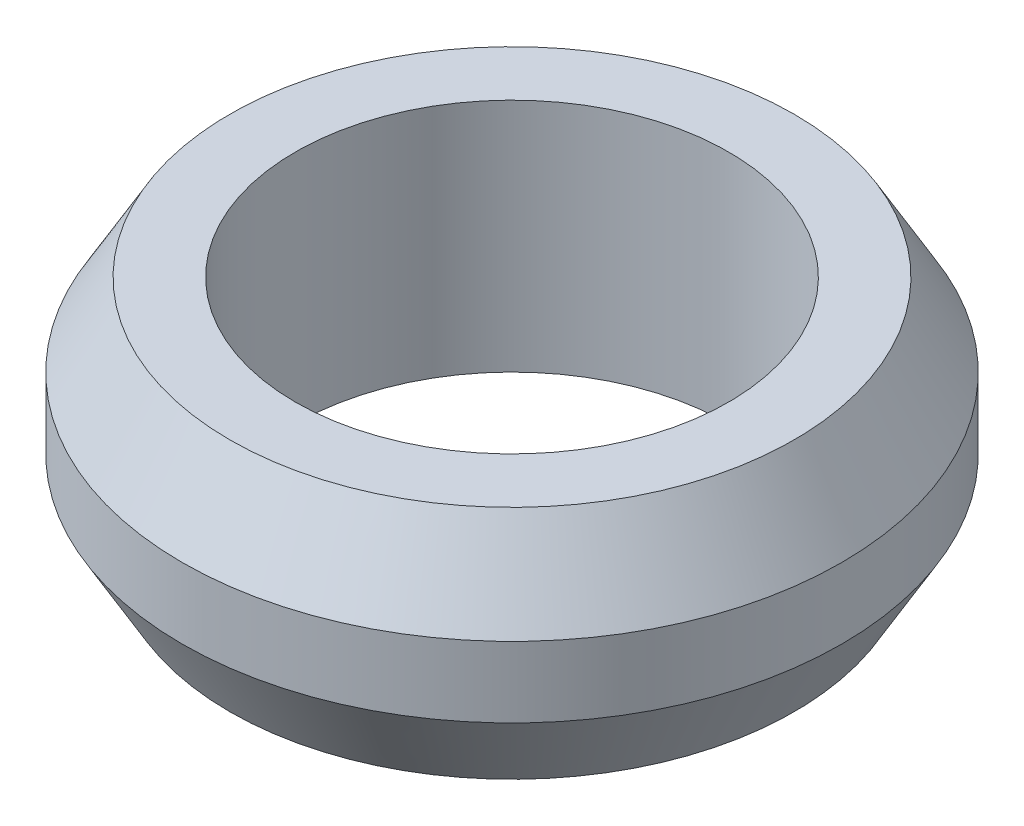
ISO-10303-21;
HEADER;
FILE_DESCRIPTION(('STEP AP214'),'2;1');
FILE_NAME('part.step','',(''),(''),'','','');
FILE_SCHEMA(('AUTOMOTIVE_DESIGN { 1 0 10303 214 1 1 1 1 }'));
ENDSEC;
DATA;
#1=APPLICATION_CONTEXT('core data for automotive mechanical design processes');
#2=APPLICATION_PROTOCOL_DEFINITION('international standard','automotive_design',2000,#1);
#3=PRODUCT_CONTEXT('',#1,'mechanical');
#4=PRODUCT('Part','Part','',(#3));
#5=PRODUCT_RELATED_PRODUCT_CATEGORY('part','',(#4));
#6=PRODUCT_DEFINITION_FORMATION('','',#4);
#7=PRODUCT_DEFINITION_CONTEXT('part definition',#1,'design');
#8=PRODUCT_DEFINITION('design','',#6,#7);
#9=PRODUCT_DEFINITION_SHAPE('','',#8);
#10=(LENGTH_UNIT() NAMED_UNIT(*) SI_UNIT(.MILLI.,.METRE.));
#11=(NAMED_UNIT(*) PLANE_ANGLE_UNIT() SI_UNIT($,.RADIAN.));
#12=(NAMED_UNIT(*) SI_UNIT($,.STERADIAN.) SOLID_ANGLE_UNIT());
#13=UNCERTAINTY_MEASURE_WITH_UNIT(LENGTH_MEASURE(1.E-05),#10,'distance_accuracy_value','');
#14=(GEOMETRIC_REPRESENTATION_CONTEXT(3) GLOBAL_UNCERTAINTY_ASSIGNED_CONTEXT((#13)) GLOBAL_UNIT_ASSIGNED_CONTEXT((#10,
#11,#12)) REPRESENTATION_CONTEXT('',''));
#15=CARTESIAN_POINT('',(0.,0.,0.));
#16=DIRECTION('',(0.,0.,1.));
#17=DIRECTION('',(1.,0.,0.));
#18=AXIS2_PLACEMENT_3D('',#15,#16,#17);
#19=CARTESIAN_POINT('',(-4.6,0.,0.));
#20=DIRECTION('',(0.,-1.,0.));
#21=DIRECTION('',(0.,0.,-1.));
#22=AXIS2_PLACEMENT_3D('',#19,#20,#21);
#23=PLANE('',#22);
#24=CARTESIAN_POINT('',(0.,0.,0.));
#25=DIRECTION('',(0.,1.,0.));
#26=DIRECTION('',(0.,0.,1.));
#27=AXIS2_PLACEMENT_3D('',#24,#25,#26);
#28=CIRCLE('',#27,4.6);
#29=CARTESIAN_POINT('',(0.,0.,4.6));
#30=VERTEX_POINT('',#29);
#31=EDGE_CURVE('E55',#30,#30,#28,.T.);
#32=ORIENTED_EDGE('',*,*,#31,.T.);
#33=EDGE_LOOP('',(#32));
#34=FACE_BOUND('',#33,.T.);
#35=CARTESIAN_POINT('',(0.,0.,0.));
#36=DIRECTION('',(0.,1.,0.));
#37=DIRECTION('',(0.,0.,1.));
#38=AXIS2_PLACEMENT_3D('',#35,#36,#37);
#39=CIRCLE('',#38,5.98963702891816);
#40=CARTESIAN_POINT('',(0.,0.,5.98963702891816));
#41=VERTEX_POINT('',#40);
#42=EDGE_CURVE('E10',#41,#41,#39,.T.);
#43=ORIENTED_EDGE('',*,*,#42,.F.);
#44=EDGE_LOOP('',(#43));
#45=FACE_BOUND('',#44,.T.);
#46=ADVANCED_FACE('F33',(#34,#45),#23,.T.);
#47=CARTESIAN_POINT('',(0.,1.75,0.));
#48=DIRECTION('',(0.,1.,0.));
#49=DIRECTION('',(0.,0.,1.));
#50=AXIS2_PLACEMENT_3D('',#47,#48,#49);
#51=CONICAL_SURFACE('',#50,7.,0.523598775598296);
#52=ORIENTED_EDGE('',*,*,#42,.T.);
#53=EDGE_LOOP('',(#52));
#54=FACE_BOUND('',#53,.T.);
#55=CARTESIAN_POINT('',(0.,1.75,0.));
#56=DIRECTION('',(0.,1.,0.));
#57=DIRECTION('',(0.,0.,1.));
#58=AXIS2_PLACEMENT_3D('',#55,#56,#57);
#59=CIRCLE('',#58,7.);
#60=CARTESIAN_POINT('',(0.,1.75,7.));
#61=VERTEX_POINT('',#60);
#62=EDGE_CURVE('E39',#61,#61,#59,.T.);
#63=ORIENTED_EDGE('',*,*,#62,.F.);
#64=EDGE_LOOP('',(#63));
#65=FACE_BOUND('',#64,.T.);
#66=ADVANCED_FACE('F73',(#54,#65),#51,.T.);
#67=CARTESIAN_POINT('',(0.,6.36863762636325,0.));
#68=DIRECTION('',(0.,1.,0.));
#69=DIRECTION('',(0.,0.,1.));
#70=AXIS2_PLACEMENT_3D('',#67,#68,#69);
#71=CYLINDRICAL_SURFACE('',#70,7.);
#72=ORIENTED_EDGE('',*,*,#62,.T.);
#73=EDGE_LOOP('',(#72));
#74=FACE_BOUND('',#73,.T.);
#75=CARTESIAN_POINT('',(0.,3.25,0.));
#76=DIRECTION('',(0.,1.,0.));
#77=DIRECTION('',(0.,0.,1.));
#78=AXIS2_PLACEMENT_3D('',#75,#76,#77);
#79=CIRCLE('',#78,7.);
#80=CARTESIAN_POINT('',(0.,3.25,7.));
#81=VERTEX_POINT('',#80);
#82=EDGE_CURVE('E43',#81,#81,#79,.T.);
#83=ORIENTED_EDGE('',*,*,#82,.F.);
#84=EDGE_LOOP('',(#83));
#85=FACE_BOUND('',#84,.T.);
#86=ADVANCED_FACE('F77',(#74,#85),#71,.T.);
#87=CARTESIAN_POINT('',(0.,5.,0.));
#88=DIRECTION('',(0.,-1.,0.));
#89=DIRECTION('',(0.,0.,-1.));
#90=AXIS2_PLACEMENT_3D('',#87,#88,#89);
#91=CONICAL_SURFACE('',#90,5.98963702891816,0.523598775598295);
#92=ORIENTED_EDGE('',*,*,#82,.T.);
#93=EDGE_LOOP('',(#92));
#94=FACE_BOUND('',#93,.T.);
#95=CARTESIAN_POINT('',(0.,5.,0.));
#96=DIRECTION('',(0.,1.,0.));
#97=DIRECTION('',(0.,0.,1.));
#98=AXIS2_PLACEMENT_3D('',#95,#96,#97);
#99=CIRCLE('',#98,5.98963702891816);
#100=CARTESIAN_POINT('',(0.,5.,5.98963702891816));
#101=VERTEX_POINT('',#100);
#102=EDGE_CURVE('E47',#101,#101,#99,.T.);
#103=ORIENTED_EDGE('',*,*,#102,.F.);
#104=EDGE_LOOP('',(#103));
#105=FACE_BOUND('',#104,.T.);
#106=ADVANCED_FACE('F69',(#94,#105),#91,.T.);
#107=CARTESIAN_POINT('',(-5.98963702891816,5.,0.));
#108=DIRECTION('',(0.,1.,0.));
#109=DIRECTION('',(0.,0.,1.));
#110=AXIS2_PLACEMENT_3D('',#107,#108,#109);
#111=PLANE('',#110);
#112=ORIENTED_EDGE('',*,*,#102,.T.);
#113=EDGE_LOOP('',(#112));
#114=FACE_BOUND('',#113,.T.);
#115=CARTESIAN_POINT('',(0.,5.,0.));
#116=DIRECTION('',(0.,1.,0.));
#117=DIRECTION('',(0.,0.,1.));
#118=AXIS2_PLACEMENT_3D('',#115,#116,#117);
#119=CIRCLE('',#118,4.6);
#120=CARTESIAN_POINT('',(0.,5.,4.6));
#121=VERTEX_POINT('',#120);
#122=EDGE_CURVE('E52',#121,#121,#119,.T.);
#123=ORIENTED_EDGE('',*,*,#122,.F.);
#124=EDGE_LOOP('',(#123));
#125=FACE_BOUND('',#124,.T.);
#126=ADVANCED_FACE('F63',(#114,#125),#111,.T.);
#127=CARTESIAN_POINT('',(0.,6.36863762636325,0.));
#128=DIRECTION('',(0.,1.,0.));
#129=DIRECTION('',(0.,0.,1.));
#130=AXIS2_PLACEMENT_3D('',#127,#128,#129);
#131=CYLINDRICAL_SURFACE('',#130,4.6);
#132=ORIENTED_EDGE('',*,*,#122,.T.);
#133=EDGE_LOOP('',(#132));
#134=FACE_BOUND('',#133,.T.);
#135=ORIENTED_EDGE('',*,*,#31,.F.);
#136=EDGE_LOOP('',(#135));
#137=FACE_BOUND('',#136,.T.);
#138=ADVANCED_FACE('F61',(#134,#137),#131,.F.);
#139=CLOSED_SHELL('',(#46,#66,#86,#106,#126,#138));
#140=MANIFOLD_SOLID_BREP('B2',#139);
#141=ADVANCED_BREP_SHAPE_REPRESENTATION('',(#18,#140),#14);
#142=SHAPE_DEFINITION_REPRESENTATION(#9,#141);
ENDSEC;
END-ISO-10303-21;
